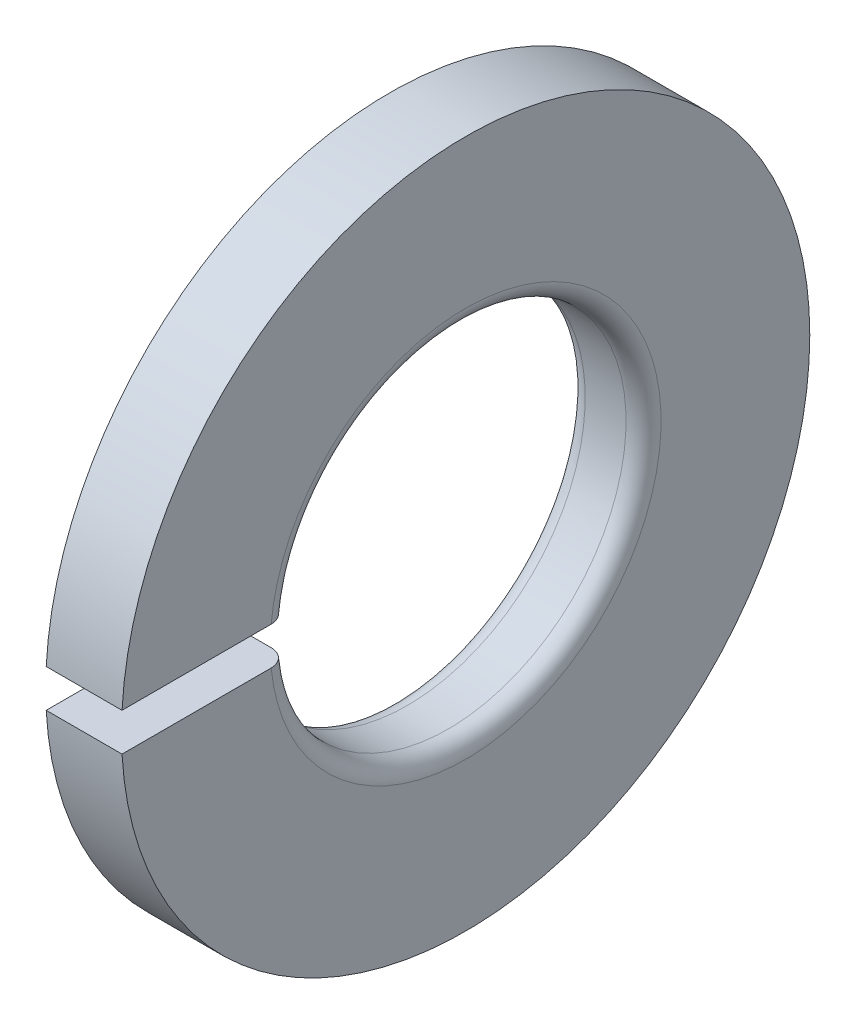
ISO-10303-21;
HEADER;
FILE_DESCRIPTION(('STEP AP214'),'2;1');
FILE_NAME('part.step','',(''),(''),'','','');
FILE_SCHEMA(('AUTOMOTIVE_DESIGN { 1 0 10303 214 1 1 1 1 }'));
ENDSEC;
DATA;
#1=APPLICATION_CONTEXT('core data for automotive mechanical design processes');
#2=APPLICATION_PROTOCOL_DEFINITION('international standard','automotive_design',2000,#1);
#3=PRODUCT_CONTEXT('',#1,'mechanical');
#4=PRODUCT('Part','Part','',(#3));
#5=PRODUCT_RELATED_PRODUCT_CATEGORY('part','',(#4));
#6=PRODUCT_DEFINITION_FORMATION('','',#4);
#7=PRODUCT_DEFINITION_CONTEXT('part definition',#1,'design');
#8=PRODUCT_DEFINITION('design','',#6,#7);
#9=PRODUCT_DEFINITION_SHAPE('','',#8);
#10=(LENGTH_UNIT() NAMED_UNIT(*) SI_UNIT(.MILLI.,.METRE.));
#11=(NAMED_UNIT(*) PLANE_ANGLE_UNIT() SI_UNIT($,.RADIAN.));
#12=(NAMED_UNIT(*) SI_UNIT($,.STERADIAN.) SOLID_ANGLE_UNIT());
#13=UNCERTAINTY_MEASURE_WITH_UNIT(LENGTH_MEASURE(1.E-05),#10,'distance_accuracy_value','');
#14=(GEOMETRIC_REPRESENTATION_CONTEXT(3) GLOBAL_UNCERTAINTY_ASSIGNED_CONTEXT((#13)) GLOBAL_UNIT_ASSIGNED_CONTEXT((#10,
#11,#12)) REPRESENTATION_CONTEXT('',''));
#15=CARTESIAN_POINT('',(0.,0.,0.));
#16=DIRECTION('',(0.,0.,1.));
#17=DIRECTION('',(1.,0.,0.));
#18=AXIS2_PLACEMENT_3D('',#15,#16,#17);
#19=CARTESIAN_POINT('',(-34.9249999999999,0.,0.));
#20=DIRECTION('',(-1.,0.,0.));
#21=DIRECTION('',(0.,0.,1.));
#22=AXIS2_PLACEMENT_3D('',#19,#20,#21);
#23=CYLINDRICAL_SURFACE('',#22,5.9);
#24=DIRECTION('',(-1.,0.,0.));
#25=VECTOR('',#24,1.);
#26=CARTESIAN_POINT('',(-34.9249999999999,0.325,5.89104192821609));
#27=LINE('',#26,#25);
#28=CARTESIAN_POINT('',(0.,0.325,5.89104192821609));
#29=VERTEX_POINT('',#28);
#30=CARTESIAN_POINT('',(-1.3,0.325,5.89104192821609));
#31=VERTEX_POINT('',#30);
#32=EDGE_CURVE('E46',#29,#31,#27,.T.);
#33=ORIENTED_EDGE('',*,*,#32,.F.);
#34=CARTESIAN_POINT('',(0.,0.,0.));
#35=DIRECTION('',(-1.,0.,0.));
#36=DIRECTION('',(0.,0.,1.));
#37=AXIS2_PLACEMENT_3D('',#34,#35,#36);
#38=CIRCLE('',#37,5.9);
#39=CARTESIAN_POINT('',(0.,-0.325,5.89104192821609));
#40=VERTEX_POINT('',#39);
#41=EDGE_CURVE('E107',#29,#40,#38,.T.);
#42=ORIENTED_EDGE('',*,*,#41,.T.);
#43=DIRECTION('',(-1.,0.,0.));
#44=VECTOR('',#43,1.);
#45=CARTESIAN_POINT('',(-34.9249999999999,-0.325,5.89104192821609));
#46=LINE('',#45,#44);
#47=CARTESIAN_POINT('',(-1.3,-0.325,5.89104192821609));
#48=VERTEX_POINT('',#47);
#49=EDGE_CURVE('E88',#48,#40,#46,.F.);
#50=ORIENTED_EDGE('',*,*,#49,.F.);
#51=CARTESIAN_POINT('',(-1.3,0.,0.));
#52=DIRECTION('',(-1.,0.,0.));
#53=DIRECTION('',(0.,0.,1.));
#54=AXIS2_PLACEMENT_3D('',#51,#52,#53);
#55=CIRCLE('',#54,5.9);
#56=EDGE_CURVE('E119',#31,#48,#55,.T.);
#57=ORIENTED_EDGE('',*,*,#56,.F.);
#58=EDGE_LOOP('',(#33,#42,#50,#57));
#59=FACE_BOUND('',#58,.T.);
#60=ADVANCED_FACE('F33',(#59),#23,.T.);
#61=CARTESIAN_POINT('',(0.,3.35,0.));
#62=DIRECTION('',(-1.,0.,0.));
#63=DIRECTION('',(0.,0.,1.));
#64=AXIS2_PLACEMENT_3D('',#61,#62,#63);
#65=PLANE('',#64);
#66=DIRECTION('',(0.,0.,-1.));
#67=VECTOR('',#66,1.);
#68=CARTESIAN_POINT('',(0.,0.325,6.018));
#69=LINE('',#68,#67);
#70=CARTESIAN_POINT('',(0.,0.325,3.33419780457009));
#71=VERTEX_POINT('',#70);
#72=EDGE_CURVE('E93',#29,#71,#69,.T.);
#73=ORIENTED_EDGE('',*,*,#72,.T.);
#74=CARTESIAN_POINT('',(0.,0.,0.));
#75=DIRECTION('',(-1.,0.,0.));
#76=DIRECTION('',(0.,0.,1.));
#77=AXIS2_PLACEMENT_3D('',#74,#75,#76);
#78=CIRCLE('',#77,3.35);
#79=CARTESIAN_POINT('',(0.,-0.325,3.33419780457009));
#80=VERTEX_POINT('',#79);
#81=EDGE_CURVE('E100',#71,#80,#78,.T.);
#82=ORIENTED_EDGE('',*,*,#81,.T.);
#83=DIRECTION('',(0.,0.,1.));
#84=VECTOR('',#83,1.);
#85=CARTESIAN_POINT('',(0.,-0.325,0.));
#86=LINE('',#85,#84);
#87=EDGE_CURVE('E82',#80,#40,#86,.T.);
#88=ORIENTED_EDGE('',*,*,#87,.T.);
#89=ORIENTED_EDGE('',*,*,#41,.F.);
#90=EDGE_LOOP('',(#73,#82,#88,#89));
#91=FACE_BOUND('',#90,.T.);
#92=ADVANCED_FACE('F106',(#91),#65,.F.);
#93=CARTESIAN_POINT('',(-0.3,0.,0.));
#94=DIRECTION('',(-1.,0.,0.));
#95=DIRECTION('',(0.,0.,1.));
#96=AXIS2_PLACEMENT_3D('',#93,#94,#95);
#97=TOROIDAL_SURFACE('',#96,3.35,0.3);
#98=ORIENTED_EDGE('',*,*,#81,.F.);
#99=CARTESIAN_POINT('',(-0.226498123668687,0.325,3.04183074200162));
#100=CARTESIAN_POINT('',(-0.242744515585017,0.325,3.0377025479102));
#101=CARTESIAN_POINT('',(-0.259350983931193,0.325,3.0349425323778));
#102=CARTESIAN_POINT('',(-0.292805099683866,0.325,3.03224896458052));
#103=CARTESIAN_POINT('',(-0.309653006615533,0.325,3.03231872415173));
#104=CARTESIAN_POINT('',(-0.343090918525181,0.325,3.03528732064511));
#105=CARTESIAN_POINT('',(-0.359681044903423,0.325,3.03818478215864));
#106=CARTESIAN_POINT('',(-0.392135440416666,0.325,3.04672118647979));
#107=CARTESIAN_POINT('',(-0.407999879711999,0.325,3.05235948296909));
#108=CARTESIAN_POINT('',(-0.438574245452535,0.325,3.06621851593708));
#109=CARTESIAN_POINT('',(-0.453283138232278,0.325,3.0744415323631));
#110=CARTESIAN_POINT('',(-0.481119909245283,0.325,3.09323061770982));
#111=CARTESIAN_POINT('',(-0.494247698369683,0.325,3.10379681859396));
#112=CARTESIAN_POINT('',(-0.518609669837064,0.325,3.12701883336983));
#113=CARTESIAN_POINT('',(-0.529835585147481,0.325,3.1396833193942));
#114=CARTESIAN_POINT('',(-0.550015326153095,0.325,3.16670871831463));
#115=CARTESIAN_POINT('',(-0.558969090249161,0.325,3.18106967718745));
#116=CARTESIAN_POINT('',(-0.574399343713508,0.325,3.21116177938331));
#117=CARTESIAN_POINT('',(-0.580862538916046,0.325,3.22689974011451));
#118=CARTESIAN_POINT('',(-0.59106603619703,0.325,3.25923490412663));
#119=CARTESIAN_POINT('',(-0.594806280650797,0.325,3.27583212558376));
#120=CARTESIAN_POINT('',(-0.599468847011608,0.325,3.30948004835985));
#121=CARTESIAN_POINT('',(-0.600380786269752,0.325,3.32653218929564));
#122=CARTESIAN_POINT('',(-0.599330948886522,0.325,3.3605479434245));
#123=CARTESIAN_POINT('',(-0.597369147074286,0.325,3.37751155584086));
#124=CARTESIAN_POINT('',(-0.590622696350612,0.325,3.41087879541672));
#125=CARTESIAN_POINT('',(-0.585836341215751,0.325,3.42728207775736));
#126=CARTESIAN_POINT('',(-0.573571363156472,0.325,3.4590493672926));
#127=CARTESIAN_POINT('',(-0.566092765454113,0.325,3.47441338422188));
#128=CARTESIAN_POINT('',(-0.548672314499113,0.325,3.50362659494921));
#129=CARTESIAN_POINT('',(-0.538736232888397,0.325,3.51747923005462));
#130=CARTESIAN_POINT('',(-0.516670851963601,0.325,3.54331125872209));
#131=CARTESIAN_POINT('',(-0.504541596407873,0.325,3.55529068964956));
#132=CARTESIAN_POINT('',(-0.478485526560587,0.325,3.57698522988537));
#133=CARTESIAN_POINT('',(-0.464566041338933,0.325,3.58670914156935));
#134=CARTESIAN_POINT('',(-0.435286951742072,0.325,3.60367119437876));
#135=CARTESIAN_POINT('',(-0.419927379655623,0.325,3.61090939122043));
#136=CARTESIAN_POINT('',(-0.388269262787063,0.325,3.62266555460194));
#137=CARTESIAN_POINT('',(-0.371974653738798,0.325,3.62719412082199));
#138=CARTESIAN_POINT('',(-0.338855698112701,0.325,3.63344372618494));
#139=CARTESIAN_POINT('',(-0.322031360225141,0.325,3.63516481136051));
#140=CARTESIAN_POINT('',(-0.288375100157215,0.325,3.63574863522724));
#141=CARTESIAN_POINT('',(-0.271543300362741,0.325,3.63461845517587));
#142=CARTESIAN_POINT('',(-0.238308664794395,0.325,3.62954753526936));
#143=CARTESIAN_POINT('',(-0.2219058267387,0.325,3.62560681036781));
#144=CARTESIAN_POINT('',(-0.189997560009378,0.325,3.61503016275534));
#145=CARTESIAN_POINT('',(-0.174491938434808,0.325,3.60839482186337));
#146=CARTESIAN_POINT('',(-0.144811541482505,0.325,3.59262041724891));
#147=CARTESIAN_POINT('',(-0.130636776771355,0.325,3.58348133346166));
#148=CARTESIAN_POINT('',(-0.103987228076645,0.325,3.56293986483647));
#149=CARTESIAN_POINT('',(-0.0915160935390733,0.325,3.55153274590626));
#150=CARTESIAN_POINT('',(-0.0686572019562961,0.325,3.52679368717718));
#151=CARTESIAN_POINT('',(-0.0582694804282598,0.325,3.51346171457087));
#152=CARTESIAN_POINT('',(-0.0398301411283011,0.325,3.48519833025404));
#153=CARTESIAN_POINT('',(-0.0317874291222566,0.325,3.4702611085629));
#154=CARTESIAN_POINT('',(-0.0183121961151184,0.325,3.43925240166351));
#155=CARTESIAN_POINT('',(-0.0128797396038778,0.325,3.42318088844234));
#156=CARTESIAN_POINT('',(-0.00475679190111677,0.325,3.3902895478757));
#157=CARTESIAN_POINT('',(-0.00207758142781536,0.325,3.37346693426171));
#158=CARTESIAN_POINT('',(0.000427146884006384,0.325,3.33961048471438));
#159=CARTESIAN_POINT('',(0.000252605264410551,0.325,3.32257664438751));
#160=CARTESIAN_POINT('',(-0.00294875244085573,0.325,3.28873091224713));
#161=CARTESIAN_POINT('',(-0.00598353441888968,0.325,3.27191977330891));
#162=CARTESIAN_POINT('',(-0.0148319725987199,0.325,3.2390459318692));
#163=CARTESIAN_POINT('',(-0.0206455373589151,0.325,3.22298320475875));
#164=CARTESIAN_POINT('',(-0.0348892252825331,0.325,3.19206415948278));
#165=CARTESIAN_POINT('',(-0.0433191792877444,0.325,3.17720776340229));
#166=CARTESIAN_POINT('',(-0.062563581802909,0.325,3.14912298026285));
#167=CARTESIAN_POINT('',(-0.0733785926249149,0.325,3.13589497826953));
#168=CARTESIAN_POINT('',(-0.097054113980665,0.325,3.11148817020749));
#169=CARTESIAN_POINT('',(-0.109909112188935,0.325,3.10030401179155));
#170=CARTESIAN_POINT('',(-0.137313184490634,0.325,3.08027758181173));
#171=CARTESIAN_POINT('',(-0.151860140933849,0.325,3.07143242721863));
#172=CARTESIAN_POINT('',(-0.176523402356349,0.325,3.05916868550487));
#173=CARTESIAN_POINT('',(-0.186254848173662,0.325,3.05495911365285));
#174=CARTESIAN_POINT('',(-0.206108975152765,0.325,3.04759449354153));
#175=CARTESIAN_POINT('',(-0.216231655354124,0.325,3.0444394426937));
#176=CARTESIAN_POINT('',(-0.226498123668687,0.325,3.04183074200162));
#177=B_SPLINE_CURVE_WITH_KNOTS('',3,(#99,#100,#101,#102,#103,#104,#105,#106,#107,#108,#109,#110,
#111,#112,#113,#114,#115,#116,#117,#118,#119,#120,#121,#122,#123,#124,#125,#126,#127,#128,#129,
#130,#131,#132,#133,#134,#135,#136,#137,#138,#139,#140,#141,#142,#143,#144,#145,#146,#147,#148,
#149,#150,#151,#152,#153,#154,#155,#156,#157,#158,#159,#160,#161,#162,#163,#164,#165,#166,#167,
#168,#169,#170,#171,#172,#173,#174,#175,#176),.UNSPECIFIED.,.T.,.F.,(4,2,2,2,2,2,2,2,2,2,2,2,2,
2,2,2,2,2,2,2,2,2,2,2,2,2,2,2,2,2,2,2,2,2,2,2,2,2,4),(0.,0.0502493826794009,0.100557576575023,
0.150841312498369,0.201113196724608,0.251429550150157,0.301748738011641,0.352281332779545,
0.402815297364493,0.453615384465198,0.504416546595885,0.55540397931018,0.606391858621897,
0.657410569674018,0.708428802773848,0.759328333801188,0.810226849389704,0.860923255039055,
0.911618524275894,0.962114161974256,1.01260897171616,1.06297849863036,1.11334775755383,
1.16370614657208,1.21406493916946,1.26452997105374,1.31499586317206,1.3656509877407,
1.4163073637476,1.46717047356226,1.51803464311457,1.56904089147968,1.62004546149411,
1.67104673458122,1.72206004484428,1.77293778648159,1.82375252136636,1.85550633871316,
1.88726007811334),.UNSPECIFIED.);
#178=CARTESIAN_POINT('',(-0.300000000000002,0.325,3.03263499287336));
#179=VERTEX_POINT('',#178);
#180=EDGE_CURVE('E126',#71,#179,#177,.T.);
#181=ORIENTED_EDGE('',*,*,#180,.T.);
#182=CARTESIAN_POINT('',(-0.300000000000002,0.,0.));
#183=DIRECTION('',(-1.,0.,0.));
#184=DIRECTION('',(0.,0.,1.));
#185=AXIS2_PLACEMENT_3D('',#182,#183,#184);
#186=CIRCLE('',#185,3.05);
#187=CARTESIAN_POINT('',(-0.300000000000002,-0.325,3.03263499287336));
#188=VERTEX_POINT('',#187);
#189=EDGE_CURVE('E102',#179,#188,#186,.T.);
#190=ORIENTED_EDGE('',*,*,#189,.T.);
#191=CARTESIAN_POINT('',(-0.226498123668687,-0.325,3.04183074200162));
#192=CARTESIAN_POINT('',(-0.210186596831718,-0.325,3.04597705735887));
#193=CARTESIAN_POINT('',(-0.194214294798696,-0.325,3.05150868934437));
#194=CARTESIAN_POINT('',(-0.163413974622394,-0.325,3.06518375063157));
#195=CARTESIAN_POINT('',(-0.148587401332001,-0.325,3.07333041308897));
#196=CARTESIAN_POINT('',(-0.120519983887883,-0.325,3.09199022076757));
#197=CARTESIAN_POINT('',(-0.107278059456728,-0.325,3.10250173959146));
#198=CARTESIAN_POINT('',(-0.0827424714320493,-0.325,3.12558807989118));
#199=CARTESIAN_POINT('',(-0.0714483403060903,-0.325,3.13816240480994));
#200=CARTESIAN_POINT('',(-0.0510761924826526,-0.325,3.16506998528467));
#201=CARTESIAN_POINT('',(-0.0420068490469574,-0.325,3.17940980743979));
#202=CARTESIAN_POINT('',(-0.0263905827545278,-0.325,3.20940347464701));
#203=CARTESIAN_POINT('',(-0.0198438259326308,-0.325,3.22505740611028));
#204=CARTESIAN_POINT('',(-0.00942836802696445,-0.325,3.25731473906194));
#205=CARTESIAN_POINT('',(-0.00557256247503439,-0.325,3.2739223052457));
#206=CARTESIAN_POINT('',(-0.000696724339495368,-0.325,3.30754870613224));
#207=CARTESIAN_POINT('',(0.000323266208491901,-0.325,3.32456754692762));
#208=CARTESIAN_POINT('',(-0.000502806975709111,-0.325,3.35857459974508));
#209=CARTESIAN_POINT('',(-0.00235540695495615,-0.325,3.37556265360075));
#210=CARTESIAN_POINT('',(-0.00888888106963789,-0.325,3.40898603839185));
#211=CARTESIAN_POINT('',(-0.013569747831896,-0.325,3.42542137076809));
#212=CARTESIAN_POINT('',(-0.0256251950936467,-0.325,3.45725563462287));
#213=CARTESIAN_POINT('',(-0.0329973239828776,-0.325,3.47265549429554));
#214=CARTESIAN_POINT('',(-0.0502306610760318,-0.325,3.50199331053235));
#215=CARTESIAN_POINT('',(-0.0600918339388163,-0.325,3.51593128784931));
#216=CARTESIAN_POINT('',(-0.08198928067385,-0.325,3.54189933824432));
#217=CARTESIAN_POINT('',(-0.0940182237933226,-0.325,3.55393559252078));
#218=CARTESIAN_POINT('',(-0.119933505072984,-0.325,3.57580747017377));
#219=CARTESIAN_POINT('',(-0.133819800993825,-0.325,3.58564314358165));
#220=CARTESIAN_POINT('',(-0.162993517842495,-0.325,3.60279154028442));
#221=CARTESIAN_POINT('',(-0.178274869237,-0.325,3.6101145897129));
#222=CARTESIAN_POINT('',(-0.209852959988259,-0.325,3.62208125572971));
#223=CARTESIAN_POINT('',(-0.226149678757301,-0.325,3.62672492662587));
#224=CARTESIAN_POINT('',(-0.25923663293245,-0.325,3.63318636369887));
#225=CARTESIAN_POINT('',(-0.276025012461112,-0.325,3.63501363583932));
#226=CARTESIAN_POINT('',(-0.309669893992544,-0.325,3.63581918721581));
#227=CARTESIAN_POINT('',(-0.326526395208584,-0.325,3.63479749926081));
#228=CARTESIAN_POINT('',(-0.359803438711731,-0.325,3.62993845861761));
#229=CARTESIAN_POINT('',(-0.376224576873389,-0.325,3.62610518478366));
#230=CARTESIAN_POINT('',(-0.408191114919638,-0.325,3.61573866955738));
#231=CARTESIAN_POINT('',(-0.423736513879488,-0.325,3.60920542531406));
#232=CARTESIAN_POINT('',(-0.453527176767264,-0.325,3.59362004718396));
#233=CARTESIAN_POINT('',(-0.467771202181873,-0.325,3.58456554631617));
#234=CARTESIAN_POINT('',(-0.494542838685064,-0.325,3.56420044600083));
#235=CARTESIAN_POINT('',(-0.507070427391252,-0.325,3.55288981713802));
#236=CARTESIAN_POINT('',(-0.530095151650448,-0.325,3.5282979288133));
#237=CARTESIAN_POINT('',(-0.540586027836659,-0.325,3.51501080933536));
#238=CARTESIAN_POINT('',(-0.559198926458378,-0.325,3.48686989218848));
#239=CARTESIAN_POINT('',(-0.567320897441876,-0.325,3.4720160605005));
#240=CARTESIAN_POINT('',(-0.581000785338771,-0.325,3.44109819506671));
#241=CARTESIAN_POINT('',(-0.586548043401715,-0.325,3.42502944517302));
#242=CARTESIAN_POINT('',(-0.594877147250872,-0.325,3.39219055632681));
#243=CARTESIAN_POINT('',(-0.597658934673491,-0.325,3.37542040257936));
#244=CARTESIAN_POINT('',(-0.600386865600861,-0.325,3.34158907551096));
#245=CARTESIAN_POINT('',(-0.600322589675956,-0.325,3.32452706148615));
#246=CARTESIAN_POINT('',(-0.597335487560814,-0.325,3.29065495348492));
#247=CARTESIAN_POINT('',(-0.59441261646624,-0.325,3.27384486347007));
#248=CARTESIAN_POINT('',(-0.585782884073543,-0.325,3.24092622145823));
#249=CARTESIAN_POINT('',(-0.580071590636598,-0.325,3.22481883093752));
#250=CARTESIAN_POINT('',(-0.566021925823393,-0.325,3.19379342755449));
#251=CARTESIAN_POINT('',(-0.55768355718016,-0.325,3.17887541345484));
#252=CARTESIAN_POINT('',(-0.538626941901467,-0.325,3.15067838543482));
#253=CARTESIAN_POINT('',(-0.527912292037977,-0.325,3.13739694114823));
#254=CARTESIAN_POINT('',(-0.50439682282469,-0.325,3.11283169779536));
#255=CARTESIAN_POINT('',(-0.491596130228729,-0.325,3.10154777744076));
#256=CARTESIAN_POINT('',(-0.464331970438395,-0.325,3.08135217866814));
#257=CARTESIAN_POINT('',(-0.449876180770509,-0.325,3.07243013565343));
#258=CARTESIAN_POINT('',(-0.419661643804758,-0.325,3.05715242584586));
#259=CARTESIAN_POINT('',(-0.40390261035317,-0.325,3.05079732448943));
#260=CARTESIAN_POINT('',(-0.371615989843898,-0.325,3.0408686713113));
#261=CARTESIAN_POINT('',(-0.355092453701711,-0.325,3.03728191811118));
#262=CARTESIAN_POINT('',(-0.321691154257043,-0.325,3.03294967628606));
#263=CARTESIAN_POINT('',(-0.304813856256752,-0.325,3.03220066532177));
#264=CARTESIAN_POINT('',(-0.277633391915343,-0.325,3.03329312750156));
#265=CARTESIAN_POINT('',(-0.267286946462197,-0.325,3.03425266643567));
#266=CARTESIAN_POINT('',(-0.246750019795707,-0.325,3.03724269280464));
#267=CARTESIAN_POINT('',(-0.236559538049966,-0.325,3.0392731765829));
#268=CARTESIAN_POINT('',(-0.226498123668687,-0.325,3.04183074200162));
#269=B_SPLINE_CURVE_WITH_KNOTS('',3,(#191,#192,#193,#194,#195,#196,#197,#198,#199,#200,#201,
#202,#203,#204,#205,#206,#207,#208,#209,#210,#211,#212,#213,#214,#215,#216,#217,#218,#219,#220,
#221,#222,#223,#224,#225,#226,#227,#228,#229,#230,#231,#232,#233,#234,#235,#236,#237,#238,#239,
#240,#241,#242,#243,#244,#245,#246,#247,#248,#249,#250,#251,#252,#253,#254,#255,#256,#257,#258,
#259,#260,#261,#262,#263,#264,#265,#266,#267,#268),.UNSPECIFIED.,.T.,.F.,(4,2,2,2,2,2,2,2,2,2,2,
2,2,2,2,2,2,2,2,2,2,2,2,2,2,2,2,2,2,2,2,2,2,2,2,2,2,2,4),(0.,0.0504526805882282,
0.100967981388296,0.151448646615857,0.201917177960184,0.252579439290684,0.303245034605435,
0.354151791733343,0.405059303454118,0.456082819414558,0.507106202359338,0.558083220971023,
0.609059515817044,0.659866552900533,0.710672434742338,0.761266945938978,0.811860431608784,
0.86228277629383,0.912704540311757,0.963053300242507,1.01340211333823,1.0637983547011,
1.11419525317018,1.16474466472485,1.21529517411797,1.26605312696206,1.31681215099943,
1.36775701898738,1.41870268725731,1.46972959753243,1.52075645472285,1.57170659777716,
1.62265364611071,1.67337327205293,1.72410406424209,1.77459141646372,1.82501608083597,
1.85613683760725,1.88725748812134),.UNSPECIFIED.);
#270=EDGE_CURVE('E85',#188,#80,#269,.T.);
#271=ORIENTED_EDGE('',*,*,#270,.T.);
#272=EDGE_LOOP('',(#98,#181,#190,#271));
#273=FACE_BOUND('',#272,.T.);
#274=ADVANCED_FACE('F98',(#273),#97,.T.);
#275=CARTESIAN_POINT('',(-34.9249999999999,0.,0.));
#276=DIRECTION('',(-1.,0.,0.));
#277=DIRECTION('',(0.,0.,1.));
#278=AXIS2_PLACEMENT_3D('',#275,#276,#277);
#279=CYLINDRICAL_SURFACE('',#278,3.05);
#280=DIRECTION('',(-1.,0.,0.));
#281=VECTOR('',#280,1.);
#282=CARTESIAN_POINT('',(-34.9249999999999,0.325,3.03263499287336));
#283=LINE('',#282,#281);
#284=CARTESIAN_POINT('',(-1.00000000000016,0.325,3.03263499287169));
#285=VERTEX_POINT('',#284);
#286=EDGE_CURVE('E134',#285,#179,#283,.F.);
#287=ORIENTED_EDGE('',*,*,#286,.F.);
#288=CARTESIAN_POINT('',(-1.,0.,0.));
#289=DIRECTION('',(-1.,0.,0.));
#290=DIRECTION('',(0.,0.,1.));
#291=AXIS2_PLACEMENT_3D('',#288,#289,#290);
#292=CIRCLE('',#291,3.05);
#293=CARTESIAN_POINT('',(-1.,-0.325,3.03263499287336));
#294=VERTEX_POINT('',#293);
#295=EDGE_CURVE('E110',#285,#294,#292,.T.);
#296=ORIENTED_EDGE('',*,*,#295,.T.);
#297=DIRECTION('',(-1.,0.,0.));
#298=VECTOR('',#297,1.);
#299=CARTESIAN_POINT('',(-34.9249999999999,-0.325,3.03263499287336));
#300=LINE('',#299,#298);
#301=EDGE_CURVE('E103',#188,#294,#300,.T.);
#302=ORIENTED_EDGE('',*,*,#301,.F.);
#303=ORIENTED_EDGE('',*,*,#189,.F.);
#304=EDGE_LOOP('',(#287,#296,#302,#303));
#305=FACE_BOUND('',#304,.T.);
#306=ADVANCED_FACE('F133',(#305),#279,.F.);
#307=CARTESIAN_POINT('',(-1.,0.,0.));
#308=DIRECTION('',(-1.,0.,0.));
#309=DIRECTION('',(0.,0.,1.));
#310=AXIS2_PLACEMENT_3D('',#307,#308,#309);
#311=TOROIDAL_SURFACE('',#310,3.35,0.3);
#312=ORIENTED_EDGE('',*,*,#295,.F.);
#313=CARTESIAN_POINT('',(-1.18095906974045,0.325,3.09369815302343));
#314=CARTESIAN_POINT('',(-1.19443605199088,0.325,3.10394747151481));
#315=CARTESIAN_POINT('',(-1.20705419249409,0.325,3.11534715604727));
#316=CARTESIAN_POINT('',(-1.23020531494537,0.325,3.1401152349053));
#317=CARTESIAN_POINT('',(-1.24073562871904,0.325,3.15348611080454));
#318=CARTESIAN_POINT('',(-1.25939862692939,0.325,3.18179618968842));
#319=CARTESIAN_POINT('',(-1.26753294017138,0.325,3.19673431784012));
#320=CARTESIAN_POINT('',(-1.28118505824941,0.325,3.22775656681722));
#321=CARTESIAN_POINT('',(-1.28670352064257,0.325,3.24384039847186));
#322=CARTESIAN_POINT('',(-1.29498907353957,0.325,3.27675826699688));
#323=CARTESIAN_POINT('',(-1.29774705635952,0.325,3.29359459701044));
#324=CARTESIAN_POINT('',(-1.30040266380048,0.325,3.32749217182983));
#325=CARTESIAN_POINT('',(-1.30030013341204,0.325,3.34455342877423));
#326=CARTESIAN_POINT('',(-1.29723341506692,0.325,3.3784452472655));
#327=CARTESIAN_POINT('',(-1.29426453712668,0.325,3.39527538487037));
#328=CARTESIAN_POINT('',(-1.28553925306303,0.325,3.42819702049327));
#329=CARTESIAN_POINT('',(-1.27978286334761,0.325,3.44428852285848));
#330=CARTESIAN_POINT('',(-1.26565253266054,0.325,3.47524949478723));
#331=CARTESIAN_POINT('',(-1.25728246741875,0.325,3.49012073287352));
#332=CARTESIAN_POINT('',(-1.23815586833213,0.325,3.5182400919561));
#333=CARTESIAN_POINT('',(-1.22739938060094,0.325,3.53148824430815));
#334=CARTESIAN_POINT('',(-1.2038462604081,0.325,3.55593351913625));
#335=CARTESIAN_POINT('',(-1.19105715104118,0.325,3.56713788978989));
#336=CARTESIAN_POINT('',(-1.16377272947971,0.325,3.58722980562338));
#337=CARTESIAN_POINT('',(-1.14927745397043,0.325,3.59611740060436));
#338=CARTESIAN_POINT('',(-1.11905656310677,0.325,3.61128520190733));
#339=CARTESIAN_POINT('',(-1.10333627213362,0.325,3.61757601732858));
#340=CARTESIAN_POINT('',(-1.07106071765838,0.325,3.62741990651482));
#341=CARTESIAN_POINT('',(-1.05450547047825,0.325,3.63097303377479));
#342=CARTESIAN_POINT('',(-1.02108457244909,0.325,3.63523135811081));
#343=CARTESIAN_POINT('',(-1.00422003268506,0.325,3.63594527934197));
#344=CARTESIAN_POINT('',(-0.970610964613404,0.325,3.63452854023961));
#345=CARTESIAN_POINT('',(-0.953866435220941,0.325,3.63239790565197));
#346=CARTESIAN_POINT('',(-0.920989789766615,0.325,3.6253575183018));
#347=CARTESIAN_POINT('',(-0.904857082339415,0.325,3.62045052610224));
#348=CARTESIAN_POINT('',(-0.873642805350414,0.325,3.60800140318822));
#349=CARTESIAN_POINT('',(-0.858561239454163,0.325,3.60045926328501));
#350=CARTESIAN_POINT('',(-0.829853552004089,0.325,3.58294466831985));
#351=CARTESIAN_POINT('',(-0.8162294932249,0.325,3.57296883268927));
#352=CARTESIAN_POINT('',(-0.790842551677464,0.325,3.55087847737018));
#353=CARTESIAN_POINT('',(-0.779079697266847,0.325,3.53876392510176));
#354=CARTESIAN_POINT('',(-0.757706251077359,0.325,3.51269757141763));
#355=CARTESIAN_POINT('',(-0.748102970198679,0.325,3.49873977572534));
#356=CARTESIAN_POINT('',(-0.731364735889293,0.325,3.46941538256803));
#357=CARTESIAN_POINT('',(-0.724229836776435,0.325,3.45404875411043));
#358=CARTESIAN_POINT('',(-0.712599894127991,0.325,3.42227466367952));
#359=CARTESIAN_POINT('',(-0.708115920748555,0.325,3.4058631496484));
#360=CARTESIAN_POINT('',(-0.701956544234576,0.325,3.37252124821961));
#361=CARTESIAN_POINT('',(-0.700281202094988,0.325,3.35559084956146));
#362=CARTESIAN_POINT('',(-0.69978310351286,0.325,3.32163074385785));
#363=CARTESIAN_POINT('',(-0.700970005490775,0.325,3.30460089455668));
#364=CARTESIAN_POINT('',(-0.706182739443883,0.325,3.27098123013935));
#365=CARTESIAN_POINT('',(-0.710208599868825,0.325,3.25439141943462));
#366=CARTESIAN_POINT('',(-0.720992911092147,0.325,3.22210566976046));
#367=CARTESIAN_POINT('',(-0.727754192200445,0.325,3.20641067589752));
#368=CARTESIAN_POINT('',(-0.743821187026447,0.325,3.17638179708103));
#369=CARTESIAN_POINT('',(-0.753126888536638,0.325,3.16204790559769));
#370=CARTESIAN_POINT('',(-0.773999719956599,0.325,3.1351832936519));
#371=CARTESIAN_POINT('',(-0.785561937336586,0.325,3.12264875699808));
#372=CARTESIAN_POINT('',(-0.81063557552246,0.325,3.09970998607514));
#373=CARTESIAN_POINT('',(-0.82414695266263,0.325,3.08930570409599));
#374=CARTESIAN_POINT('',(-0.852667745030066,0.325,3.0709761654954));
#375=CARTESIAN_POINT('',(-0.867669795205075,0.325,3.06303944947735));
#376=CARTESIAN_POINT('',(-0.898797802487082,0.325,3.04981262536619));
#377=CARTESIAN_POINT('',(-0.914923680081518,0.325,3.04452233025077));
#378=CARTESIAN_POINT('',(-0.947751242693576,0.325,3.03676513135983));
#379=CARTESIAN_POINT('',(-0.964449466031875,0.325,3.03428357206458));
#380=CARTESIAN_POINT('',(-0.998029828357706,0.325,3.03216745523395));
#381=CARTESIAN_POINT('',(-1.01491200885333,0.325,3.03253355410821));
#382=CARTESIAN_POINT('',(-1.04833311225503,0.325,3.03609815879684));
#383=CARTESIAN_POINT('',(-1.06487274013891,0.325,3.03929009694547));
#384=CARTESIAN_POINT('',(-1.09716751596199,0.325,3.04840217827841));
#385=CARTESIAN_POINT('',(-1.11292358962782,0.325,3.05431901300945));
#386=CARTESIAN_POINT('',(-1.13740629323152,0.325,3.06593962275949));
#387=CARTESIAN_POINT('',(-1.14651451394933,0.325,3.07085754213303));
#388=CARTESIAN_POINT('',(-1.16417498596073,0.325,3.08160663174797));
#389=CARTESIAN_POINT('',(-1.17272723827786,0.325,3.08743780030799));
#390=CARTESIAN_POINT('',(-1.18095906974045,0.325,3.09369815302343));
#391=B_SPLINE_CURVE_WITH_KNOTS('',3,(#313,#314,#315,#316,#317,#318,#319,#320,#321,#322,#323,
#324,#325,#326,#327,#328,#329,#330,#331,#332,#333,#334,#335,#336,#337,#338,#339,#340,#341,#342,
#343,#344,#345,#346,#347,#348,#349,#350,#351,#352,#353,#354,#355,#356,#357,#358,#359,#360,#361,
#362,#363,#364,#365,#366,#367,#368,#369,#370,#371,#372,#373,#374,#375,#376,#377,#378,#379,#380,
#381,#382,#383,#384,#385,#386,#387,#388,#389,#390),.UNSPECIFIED.,.T.,.F.,(4,2,2,2,2,2,2,2,2,2,2,
2,2,2,2,2,2,2,2,2,2,2,2,2,2,2,2,2,2,2,2,2,2,2,2,2,2,2,4),(0.,0.0507566773147823,
0.101577807727959,0.152364309689774,0.203138038462306,0.254078738818696,0.305022199625584,
0.356049156804362,0.407075813629252,0.458027161239121,0.508977524384775,0.559743523870188,
0.610508432005573,0.66106383775383,0.711618255613977,0.762017212077137,0.812415712385915,
0.862764188753893,0.913112840688727,0.963531832567099,1.01395159256397,1.06453955388528,
1.11512862834656,1.16592749517229,1.21672746518108,1.26769909547117,1.31867123656504,
1.36969625341305,1.42072102545967,1.47163592922882,1.52254969256261,1.5732233527669,
1.62389343136256,1.67429788510386,1.72471395784856,1.77501316294597,1.82525145725166,
1.85625403444079,1.88725655455196),.UNSPECIFIED.);
#392=CARTESIAN_POINT('',(-1.3,0.325,3.33419780457009));
#393=VERTEX_POINT('',#392);
#394=EDGE_CURVE('E120',#285,#393,#391,.T.);
#395=ORIENTED_EDGE('',*,*,#394,.T.);
#396=CARTESIAN_POINT('',(-1.3,0.,0.));
#397=DIRECTION('',(-1.,0.,0.));
#398=DIRECTION('',(0.,0.,1.));
#399=AXIS2_PLACEMENT_3D('',#396,#397,#398);
#400=CIRCLE('',#399,3.35);
#401=CARTESIAN_POINT('',(-1.3,-0.325,3.33419780457009));
#402=VERTEX_POINT('',#401);
#403=EDGE_CURVE('E123',#393,#402,#400,.T.);
#404=ORIENTED_EDGE('',*,*,#403,.T.);
#405=CARTESIAN_POINT('',(-1.18095906974045,-0.325,3.09369815302343));
#406=CARTESIAN_POINT('',(-1.1675821525327,-0.325,3.08352680919798));
#407=CARTESIAN_POINT('',(-1.15333993038132,-0.325,3.07447389716066));
#408=CARTESIAN_POINT('',(-1.12352710210715,-0.325,3.05887816862047));
#409=CARTESIAN_POINT('',(-1.10795500078922,-0.325,3.05233822411567));
#410=CARTESIAN_POINT('',(-1.07593595227345,-0.325,3.04197100579202));
#411=CARTESIAN_POINT('',(-1.05948927155396,-0.325,3.03814291072505));
#412=CARTESIAN_POINT('',(-1.02619042755367,-0.325,3.03331126653454));
#413=CARTESIAN_POINT('',(-1.00933836443496,-0.325,3.03230702677613));
#414=CARTESIAN_POINT('',(-0.975745878788045,-0.325,3.03314944781884));
#415=CARTESIAN_POINT('',(-0.959005286013811,-0.325,3.03498932932259));
#416=CARTESIAN_POINT('',(-0.926070175009833,-0.325,3.04145337206197));
#417=CARTESIAN_POINT('',(-0.909875674769821,-0.325,3.04607762492772));
#418=CARTESIAN_POINT('',(-0.878488992807423,-0.325,3.05797568784788));
#419=CARTESIAN_POINT('',(-0.863296945730367,-0.325,3.06524985297531));
#420=CARTESIAN_POINT('',(-0.834343479065744,-0.325,3.08223623898638));
#421=CARTESIAN_POINT('',(-0.820582080889762,-0.325,3.09194849635192));
#422=CARTESIAN_POINT('',(-0.794823581034305,-0.325,3.11357284503435));
#423=CARTESIAN_POINT('',(-0.782833331744676,-0.325,3.1254930978361));
#424=CARTESIAN_POINT('',(-0.761011379445957,-0.325,3.15116804780657));
#425=CARTESIAN_POINT('',(-0.751179733644501,-0.325,3.16492279357779));
#426=CARTESIAN_POINT('',(-0.733899379062905,-0.325,3.19395445872285));
#427=CARTESIAN_POINT('',(-0.72646355118629,-0.325,3.20923904550131));
#428=CARTESIAN_POINT('',(-0.714251339244263,-0.325,3.24083613767578));
#429=CARTESIAN_POINT('',(-0.70947502432239,-0.325,3.25714866978463));
#430=CARTESIAN_POINT('',(-0.702699648816412,-0.325,3.29041098521039));
#431=CARTESIAN_POINT('',(-0.70071212645474,-0.325,3.30736311975916));
#432=CARTESIAN_POINT('',(-0.699607394539796,-0.325,3.34136078504169));
#433=CARTESIAN_POINT('',(-0.700490215332545,-0.325,3.35840631676098));
#434=CARTESIAN_POINT('',(-0.705105966925086,-0.325,3.39212842365671));
#435=CARTESIAN_POINT('',(-0.708842364509342,-0.325,3.40880452463799));
#436=CARTESIAN_POINT('',(-0.719066937208198,-0.325,3.44129083025241));
#437=CARTESIAN_POINT('',(-0.72555509589359,-0.325,3.45710104005467));
#438=CARTESIAN_POINT('',(-0.741088438823453,-0.325,3.48737425398332));
#439=CARTESIAN_POINT('',(-0.750128872382004,-0.325,3.50183969532263));
#440=CARTESIAN_POINT('',(-0.770518651904467,-0.325,3.52903995663402));
#441=CARTESIAN_POINT('',(-0.781867954766902,-0.325,3.54177480890497));
#442=CARTESIAN_POINT('',(-0.806507742985198,-0.325,3.56510037142465));
#443=CARTESIAN_POINT('',(-0.81979071153495,-0.325,3.57569902171564));
#444=CARTESIAN_POINT('',(-0.847953542170532,-0.325,3.59450502237202));
#445=CARTESIAN_POINT('',(-0.862833368185693,-0.325,3.6027124267366));
#446=CARTESIAN_POINT('',(-0.893702364442607,-0.325,3.61646844861824));
#447=CARTESIAN_POINT('',(-0.909686776905588,-0.325,3.62202774357467));
#448=CARTESIAN_POINT('',(-0.942363461556972,-0.325,3.63037525676257));
#449=CARTESIAN_POINT('',(-0.959055720857801,-0.325,3.63316352542281));
#450=CARTESIAN_POINT('',(-0.992623515004373,-0.325,3.63588384745655));
#451=CARTESIAN_POINT('',(-1.00949839518084,-0.325,3.63582398522858));
#452=CARTESIAN_POINT('',(-1.04299810871782,-0.325,3.63286991182383));
#453=CARTESIAN_POINT('',(-1.05962294386255,-0.325,3.62997572088147));
#454=CARTESIAN_POINT('',(-1.09213955516715,-0.325,3.62143989388894));
#455=CARTESIAN_POINT('',(-1.10803181426449,-0.325,3.61580009702643));
#456=CARTESIAN_POINT('',(-1.13864617672702,-0.325,3.6019368669638));
#457=CARTESIAN_POINT('',(-1.15336827515594,-0.325,3.59371342286539));
#458=CARTESIAN_POINT('',(-1.18125251643684,-0.325,3.57490319938074));
#459=CARTESIAN_POINT('',(-1.1944119607003,-0.325,3.56431242011835));
#460=CARTESIAN_POINT('',(-1.21877380325698,-0.325,3.54107894600768));
#461=CARTESIAN_POINT('',(-1.22997616579373,-0.325,3.52843621367775));
#462=CARTESIAN_POINT('',(-1.25014874347094,-0.325,3.5014106993278));
#463=CARTESIAN_POINT('',(-1.25911095462641,-0.325,3.48702194324881));
#464=CARTESIAN_POINT('',(-1.27450405882956,-0.325,3.45694881159968));
#465=CARTESIAN_POINT('',(-1.28093488984492,-0.325,3.44126440429057));
#466=CARTESIAN_POINT('',(-1.29111034889592,-0.325,3.40897533886155));
#467=CARTESIAN_POINT('',(-1.29484369147981,-0.325,3.39236712405377));
#468=CARTESIAN_POINT('',(-1.29947862215236,-0.325,3.35876074175936));
#469=CARTESIAN_POINT('',(-1.30038026222089,-0.325,3.3417625814365));
#470=CARTESIAN_POINT('',(-1.29932698723614,-0.325,3.30780315484791));
#471=CARTESIAN_POINT('',(-1.29736337598164,-0.325,3.29084215802347));
#472=CARTESIAN_POINT('',(-1.29061772633259,-0.325,3.25748525111047));
#473=CARTESIAN_POINT('',(-1.28583496708331,-0.325,3.24108948668696));
#474=CARTESIAN_POINT('',(-1.27357823210994,-0.325,3.20931739785209));
#475=CARTESIAN_POINT('',(-1.26610128889797,-0.325,3.1939422197579));
#476=CARTESIAN_POINT('',(-1.24867006804057,-0.325,3.16468388102436));
#477=CARTESIAN_POINT('',(-1.23871879056298,-0.325,3.15079894242509));
#478=CARTESIAN_POINT('',(-1.22070654575582,-0.325,3.12969218127018));
#479=CARTESIAN_POINT('',(-1.21330132818421,-0.325,3.12190113845433));
#480=CARTESIAN_POINT('',(-1.19770153880493,-0.325,3.10715388691145));
#481=CARTESIAN_POINT('',(-1.1895069673256,-0.325,3.10019767783718));
#482=CARTESIAN_POINT('',(-1.18095906974045,-0.325,3.09369815302343));
#483=B_SPLINE_CURVE_WITH_KNOTS('',3,(#405,#406,#407,#408,#409,#410,#411,#412,#413,#414,#415,
#416,#417,#418,#419,#420,#421,#422,#423,#424,#425,#426,#427,#428,#429,#430,#431,#432,#433,#434,
#435,#436,#437,#438,#439,#440,#441,#442,#443,#444,#445,#446,#447,#448,#449,#450,#451,#452,#453,
#454,#455,#456,#457,#458,#459,#460,#461,#462,#463,#464,#465,#466,#467,#468,#469,#470,#471,#472,
#473,#474,#475,#476,#477,#478,#479,#480,#481,#482),.UNSPECIFIED.,.T.,.F.,(4,2,2,2,2,2,2,2,2,2,2,
2,2,2,2,2,2,2,2,2,2,2,2,2,2,2,2,2,2,2,2,2,2,2,2,2,2,2,4),(0.,0.0503751513882562,
0.100807705049743,0.151224979335955,0.20162992191493,0.251914903520887,0.302201540032058,
0.35249491714353,0.402789046854717,0.45327293088934,0.50375815269397,0.554510442071464,
0.605264050874402,0.656227032301948,0.70719055252525,0.758216086550622,0.809241315935667,
0.860172188522837,0.911102110430588,0.9618390907928,1.01257492532211,1.06310441901831,
1.11363299313255,1.1640181508419,1.21440294885172,1.26475404214987,1.31510534784078,
1.3655423795084,1.41598033257909,1.46659600237436,1.51721291244646,1.56804038069788,
1.61886691593444,1.66984803382677,1.72084219322391,1.77189269229395,1.82288159116084,
1.8550715051237,1.8872614056976),.UNSPECIFIED.);
#484=EDGE_CURVE('E54',#402,#294,#483,.T.);
#485=ORIENTED_EDGE('',*,*,#484,.T.);
#486=EDGE_LOOP('',(#312,#395,#404,#485));
#487=FACE_BOUND('',#486,.T.);
#488=ADVANCED_FACE('F137',(#487),#311,.T.);
#489=CARTESIAN_POINT('',(-1.3,5.9,0.));
#490=DIRECTION('',(1.,0.,0.));
#491=DIRECTION('',(0.,0.,-1.));
#492=AXIS2_PLACEMENT_3D('',#489,#490,#491);
#493=PLANE('',#492);
#494=DIRECTION('',(0.,0.,-1.));
#495=VECTOR('',#494,1.);
#496=CARTESIAN_POINT('',(-1.3,0.325,0.));
#497=LINE('',#496,#495);
#498=EDGE_CURVE('E11',#31,#393,#497,.T.);
#499=ORIENTED_EDGE('',*,*,#498,.F.);
#500=ORIENTED_EDGE('',*,*,#56,.T.);
#501=DIRECTION('',(0.,0.,1.));
#502=VECTOR('',#501,1.);
#503=CARTESIAN_POINT('',(-1.3,-0.325,0.));
#504=LINE('',#503,#502);
#505=EDGE_CURVE('E40',#402,#48,#504,.T.);
#506=ORIENTED_EDGE('',*,*,#505,.F.);
#507=ORIENTED_EDGE('',*,*,#403,.F.);
#508=EDGE_LOOP('',(#499,#500,#506,#507));
#509=FACE_BOUND('',#508,.T.);
#510=ADVANCED_FACE('F122',(#509),#493,.F.);
#511=CARTESIAN_POINT('',(-1.3,-0.325,0.));
#512=DIRECTION('',(0.,1.,0.));
#513=DIRECTION('',(0.,0.,1.));
#514=AXIS2_PLACEMENT_3D('',#511,#512,#513);
#515=PLANE('',#514);
#516=ORIENTED_EDGE('',*,*,#49,.T.);
#517=ORIENTED_EDGE('',*,*,#87,.F.);
#518=ORIENTED_EDGE('',*,*,#270,.F.);
#519=ORIENTED_EDGE('',*,*,#301,.T.);
#520=ORIENTED_EDGE('',*,*,#484,.F.);
#521=ORIENTED_EDGE('',*,*,#505,.T.);
#522=EDGE_LOOP('',(#516,#517,#518,#519,#520,#521));
#523=FACE_BOUND('',#522,.T.);
#524=ADVANCED_FACE('F84',(#523),#515,.T.);
#525=CARTESIAN_POINT('',(-1.3,0.325,6.018));
#526=DIRECTION('',(0.,-1.,0.));
#527=DIRECTION('',(0.,0.,-1.));
#528=AXIS2_PLACEMENT_3D('',#525,#526,#527);
#529=PLANE('',#528);
#530=ORIENTED_EDGE('',*,*,#32,.T.);
#531=ORIENTED_EDGE('',*,*,#498,.T.);
#532=ORIENTED_EDGE('',*,*,#394,.F.);
#533=ORIENTED_EDGE('',*,*,#286,.T.);
#534=ORIENTED_EDGE('',*,*,#180,.F.);
#535=ORIENTED_EDGE('',*,*,#72,.F.);
#536=EDGE_LOOP('',(#530,#531,#532,#533,#534,#535));
#537=FACE_BOUND('',#536,.T.);
#538=ADVANCED_FACE('F152',(#537),#529,.T.);
#539=CLOSED_SHELL('',(#60,#92,#274,#306,#488,#510,#524,#538));
#540=MANIFOLD_SOLID_BREP('B2',#539);
#541=ADVANCED_BREP_SHAPE_REPRESENTATION('',(#18,#540),#14);
#542=SHAPE_DEFINITION_REPRESENTATION(#9,#541);
ENDSEC;
END-ISO-10303-21;
